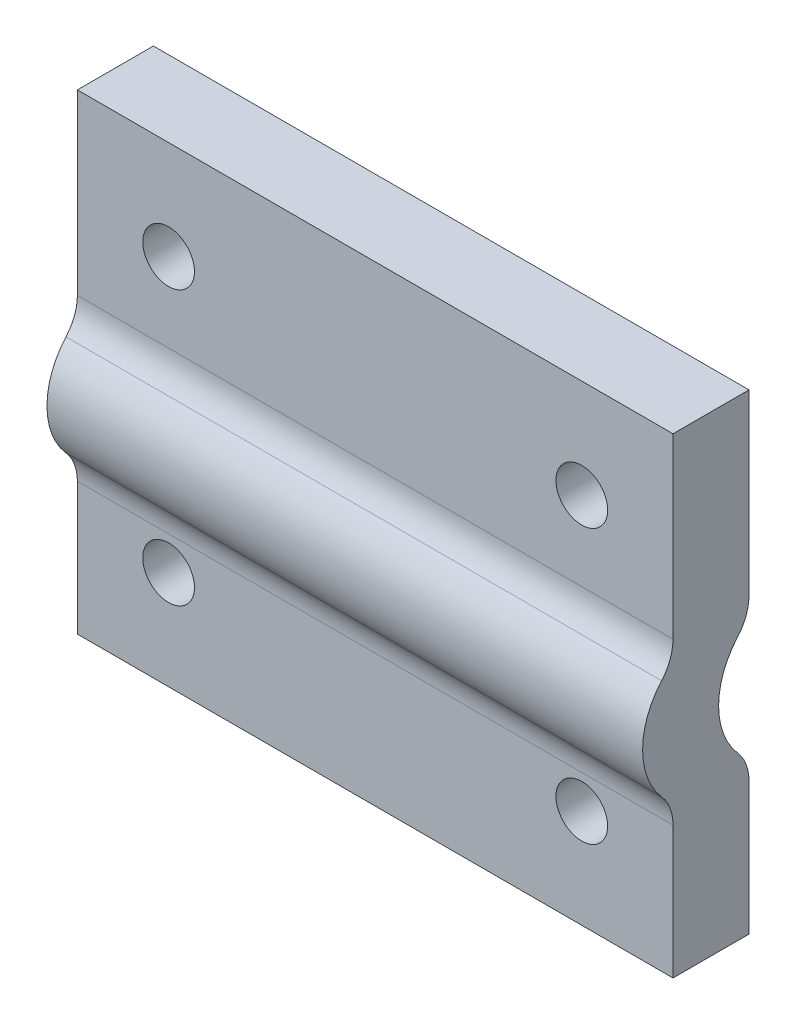
ISO-10303-21;
HEADER;
FILE_DESCRIPTION(('STEP AP214'),'2;1');
FILE_NAME('part.step','',(''),(''),'','','');
FILE_SCHEMA(('AUTOMOTIVE_DESIGN { 1 0 10303 214 1 1 1 1 }'));
ENDSEC;
DATA;
#1=APPLICATION_CONTEXT('core data for automotive mechanical design processes');
#2=APPLICATION_PROTOCOL_DEFINITION('international standard','automotive_design',2000,#1);
#3=PRODUCT_CONTEXT('',#1,'mechanical');
#4=PRODUCT('Part','Part','',(#3));
#5=PRODUCT_RELATED_PRODUCT_CATEGORY('part','',(#4));
#6=PRODUCT_DEFINITION_FORMATION('','',#4);
#7=PRODUCT_DEFINITION_CONTEXT('part definition',#1,'design');
#8=PRODUCT_DEFINITION('design','',#6,#7);
#9=PRODUCT_DEFINITION_SHAPE('','',#8);
#10=(LENGTH_UNIT() NAMED_UNIT(*) SI_UNIT(.MILLI.,.METRE.));
#11=(NAMED_UNIT(*) PLANE_ANGLE_UNIT() SI_UNIT($,.RADIAN.));
#12=(NAMED_UNIT(*) SI_UNIT($,.STERADIAN.) SOLID_ANGLE_UNIT());
#13=UNCERTAINTY_MEASURE_WITH_UNIT(LENGTH_MEASURE(1.E-05),#10,'distance_accuracy_value','');
#14=(GEOMETRIC_REPRESENTATION_CONTEXT(3) GLOBAL_UNCERTAINTY_ASSIGNED_CONTEXT((#13)) GLOBAL_UNIT_ASSIGNED_CONTEXT((#10,
#11,#12)) REPRESENTATION_CONTEXT('',''));
#15=CARTESIAN_POINT('',(0.,0.,0.));
#16=DIRECTION('',(0.,0.,1.));
#17=DIRECTION('',(1.,0.,0.));
#18=AXIS2_PLACEMENT_3D('',#15,#16,#17);
#19=CARTESIAN_POINT('',(-20.5399999999997,0.,5.));
#20=DIRECTION('',(1.,0.,0.));
#21=DIRECTION('',(0.,1.,0.));
#22=AXIS2_PLACEMENT_3D('',#19,#20,#21);
#23=PLANE('',#22);
#24=DIRECTION('',(0.,-1.,0.));
#25=VECTOR('',#24,1.);
#26=CARTESIAN_POINT('',(-20.5399999999997,0.,0.));
#27=LINE('',#26,#25);
#28=CARTESIAN_POINT('',(-20.5399999999997,52.1440002712051,0.));
#29=VERTEX_POINT('',#28);
#30=CARTESIAN_POINT('',(-20.5399999999997,40.4355028933343,0.));
#31=VERTEX_POINT('',#30);
#32=EDGE_CURVE('E154',#29,#31,#27,.T.);
#33=ORIENTED_EDGE('',*,*,#32,.T.);
#34=CARTESIAN_POINT('',(-20.5399999999997,40.4355028933343,3.));
#35=DIRECTION('',(1.,0.,0.));
#36=DIRECTION('',(0.,1.,0.));
#37=AXIS2_PLACEMENT_3D('',#34,#35,#36);
#38=CIRCLE('',#37,3.);
#39=CARTESIAN_POINT('',(-20.5399999999997,38.4511894100358,0.75));
#40=VERTEX_POINT('',#39);
#41=EDGE_CURVE('E184',#31,#40,#38,.F.);
#42=ORIENTED_EDGE('',*,*,#41,.T.);
#43=CARTESIAN_POINT('',(-20.5399999999997,35.144000271205,-3.));
#44=DIRECTION('',(-1.,0.,0.));
#45=DIRECTION('',(0.,-1.,0.));
#46=AXIS2_PLACEMENT_3D('',#43,#44,#45);
#47=CIRCLE('',#46,5.);
#48=CARTESIAN_POINT('',(-20.5399999999997,31.8368111323743,0.75));
#49=VERTEX_POINT('',#48);
#50=EDGE_CURVE('E131',#40,#49,#47,.F.);
#51=ORIENTED_EDGE('',*,*,#50,.T.);
#52=CARTESIAN_POINT('',(-20.5399999999997,29.8524976490759,3.));
#53=DIRECTION('',(1.,0.,0.));
#54=DIRECTION('',(0.,1.,0.));
#55=AXIS2_PLACEMENT_3D('',#52,#53,#54);
#56=CIRCLE('',#55,3.);
#57=CARTESIAN_POINT('',(-20.5399999999997,29.8524976490759,0.));
#58=VERTEX_POINT('',#57);
#59=EDGE_CURVE('E182',#49,#58,#56,.F.);
#60=ORIENTED_EDGE('',*,*,#59,.T.);
#61=DIRECTION('',(0.,-1.,0.));
#62=VECTOR('',#61,1.);
#63=CARTESIAN_POINT('',(-20.5399999999997,0.,0.));
#64=LINE('',#63,#62);
#65=CARTESIAN_POINT('',(-20.5399999999997,21.1440002712051,0.));
#66=VERTEX_POINT('',#65);
#67=EDGE_CURVE('E129',#58,#66,#64,.T.);
#68=ORIENTED_EDGE('',*,*,#67,.T.);
#69=DIRECTION('',(0.,0.,-1.));
#70=VECTOR('',#69,1.);
#71=CARTESIAN_POINT('',(-20.5399999999997,21.1440002712051,5.));
#72=LINE('',#71,#70);
#73=CARTESIAN_POINT('',(-20.5399999999997,21.1440002712051,5.));
#74=VERTEX_POINT('',#73);
#75=EDGE_CURVE('E123',#74,#66,#72,.T.);
#76=ORIENTED_EDGE('',*,*,#75,.F.);
#77=DIRECTION('',(0.,-1.,0.));
#78=VECTOR('',#77,1.);
#79=CARTESIAN_POINT('',(-20.5399999999997,0.,5.));
#80=LINE('',#79,#78);
#81=CARTESIAN_POINT('',(-20.5399999999997,29.8524976490759,5.));
#82=VERTEX_POINT('',#81);
#83=EDGE_CURVE('E108',#82,#74,#80,.T.);
#84=ORIENTED_EDGE('',*,*,#83,.F.);
#85=CARTESIAN_POINT('',(-20.5399999999997,29.8524976490759,8.));
#86=DIRECTION('',(1.,0.,0.));
#87=DIRECTION('',(0.,1.,0.));
#88=AXIS2_PLACEMENT_3D('',#85,#86,#87);
#89=CIRCLE('',#88,3.);
#90=CARTESIAN_POINT('',(-20.5399999999997,31.8368111323744,5.75));
#91=VERTEX_POINT('',#90);
#92=EDGE_CURVE('E25',#82,#91,#89,.T.);
#93=ORIENTED_EDGE('',*,*,#92,.T.);
#94=CARTESIAN_POINT('',(-20.5399999999997,35.144000271205,2.));
#95=DIRECTION('',(-1.,0.,0.));
#96=DIRECTION('',(0.,-1.,0.));
#97=AXIS2_PLACEMENT_3D('',#94,#95,#96);
#98=CIRCLE('',#97,5.);
#99=CARTESIAN_POINT('',(-20.5399999999997,38.4511894100358,5.75));
#100=VERTEX_POINT('',#99);
#101=EDGE_CURVE('E134',#100,#91,#98,.F.);
#102=ORIENTED_EDGE('',*,*,#101,.F.);
#103=CARTESIAN_POINT('',(-20.5399999999997,40.4355028933342,8.));
#104=DIRECTION('',(1.,0.,0.));
#105=DIRECTION('',(0.,1.,0.));
#106=AXIS2_PLACEMENT_3D('',#103,#104,#105);
#107=CIRCLE('',#106,3.);
#108=CARTESIAN_POINT('',(-20.5399999999997,40.4355028933342,5.));
#109=VERTEX_POINT('',#108);
#110=EDGE_CURVE('E204',#100,#109,#107,.T.);
#111=ORIENTED_EDGE('',*,*,#110,.T.);
#112=DIRECTION('',(0.,-1.,0.));
#113=VECTOR('',#112,1.);
#114=CARTESIAN_POINT('',(-20.5399999999997,0.,5.));
#115=LINE('',#114,#113);
#116=CARTESIAN_POINT('',(-20.5399999999997,52.1440002712051,5.));
#117=VERTEX_POINT('',#116);
#118=EDGE_CURVE('E171',#117,#109,#115,.T.);
#119=ORIENTED_EDGE('',*,*,#118,.F.);
#120=DIRECTION('',(0.,0.,-1.));
#121=VECTOR('',#120,1.);
#122=CARTESIAN_POINT('',(-20.5399999999997,52.1440002712051,5.));
#123=LINE('',#122,#121);
#124=EDGE_CURVE('E147',#117,#29,#123,.T.);
#125=ORIENTED_EDGE('',*,*,#124,.T.);
#126=EDGE_LOOP('',(#33,#42,#51,#60,#68,#76,#84,#93,#102,#111,#119,#125));
#127=FACE_BOUND('',#126,.T.);
#128=ADVANCED_FACE('F17',(#127),#23,.F.);
#129=CARTESIAN_POINT('',(18.6350000000003,0.,5.));
#130=DIRECTION('',(-1.,0.,0.));
#131=DIRECTION('',(0.,0.,1.));
#132=AXIS2_PLACEMENT_3D('',#129,#130,#131);
#133=PLANE('',#132);
#134=CARTESIAN_POINT('',(18.6350000000003,35.144000271205,-3.));
#135=DIRECTION('',(-1.,0.,0.));
#136=DIRECTION('',(0.,0.,1.));
#137=AXIS2_PLACEMENT_3D('',#134,#135,#136);
#138=CIRCLE('',#137,5.);
#139=CARTESIAN_POINT('',(18.6350000000003,31.8368111323743,0.75));
#140=VERTEX_POINT('',#139);
#141=CARTESIAN_POINT('',(18.6350000000003,38.4511894100358,0.75));
#142=VERTEX_POINT('',#141);
#143=EDGE_CURVE('E141',#140,#142,#138,.T.);
#144=ORIENTED_EDGE('',*,*,#143,.T.);
#145=CARTESIAN_POINT('',(18.6350000000003,40.4355028933343,3.));
#146=DIRECTION('',(-1.,0.,0.));
#147=DIRECTION('',(0.,0.,1.));
#148=AXIS2_PLACEMENT_3D('',#145,#146,#147);
#149=CIRCLE('',#148,3.);
#150=CARTESIAN_POINT('',(18.6350000000003,40.4355028933343,0.));
#151=VERTEX_POINT('',#150);
#152=EDGE_CURVE('E193',#142,#151,#149,.F.);
#153=ORIENTED_EDGE('',*,*,#152,.T.);
#154=DIRECTION('',(0.,1.,0.));
#155=VECTOR('',#154,1.);
#156=CARTESIAN_POINT('',(18.6350000000003,0.,0.));
#157=LINE('',#156,#155);
#158=CARTESIAN_POINT('',(18.6350000000003,52.1440002712051,0.));
#159=VERTEX_POINT('',#158);
#160=EDGE_CURVE('E165',#151,#159,#157,.T.);
#161=ORIENTED_EDGE('',*,*,#160,.T.);
#162=DIRECTION('',(0.,0.,-1.));
#163=VECTOR('',#162,1.);
#164=CARTESIAN_POINT('',(18.6350000000003,52.1440002712051,5.));
#165=LINE('',#164,#163);
#166=CARTESIAN_POINT('',(18.6350000000003,52.1440002712051,5.));
#167=VERTEX_POINT('',#166);
#168=EDGE_CURVE('E148',#167,#159,#165,.T.);
#169=ORIENTED_EDGE('',*,*,#168,.F.);
#170=DIRECTION('',(0.,1.,0.));
#171=VECTOR('',#170,1.);
#172=CARTESIAN_POINT('',(18.6350000000003,0.,5.));
#173=LINE('',#172,#171);
#174=CARTESIAN_POINT('',(18.6350000000003,40.4355028933343,5.));
#175=VERTEX_POINT('',#174);
#176=EDGE_CURVE('E158',#175,#167,#173,.T.);
#177=ORIENTED_EDGE('',*,*,#176,.F.);
#178=CARTESIAN_POINT('',(18.6350000000003,40.4355028933343,8.));
#179=DIRECTION('',(-1.,0.,0.));
#180=DIRECTION('',(0.,0.,1.));
#181=AXIS2_PLACEMENT_3D('',#178,#179,#180);
#182=CIRCLE('',#181,3.);
#183=CARTESIAN_POINT('',(18.6350000000003,38.4511894100358,5.75));
#184=VERTEX_POINT('',#183);
#185=EDGE_CURVE('E206',#175,#184,#182,.T.);
#186=ORIENTED_EDGE('',*,*,#185,.T.);
#187=CARTESIAN_POINT('',(18.6350000000003,35.144000271205,2.));
#188=DIRECTION('',(-1.,0.,0.));
#189=DIRECTION('',(0.,0.,1.));
#190=AXIS2_PLACEMENT_3D('',#187,#188,#189);
#191=CIRCLE('',#190,5.);
#192=CARTESIAN_POINT('',(18.6350000000003,31.8368111323744,5.75));
#193=VERTEX_POINT('',#192);
#194=EDGE_CURVE('E139',#193,#184,#191,.T.);
#195=ORIENTED_EDGE('',*,*,#194,.F.);
#196=CARTESIAN_POINT('',(18.6350000000003,29.8524976490759,8.));
#197=DIRECTION('',(-1.,0.,0.));
#198=DIRECTION('',(0.,0.,1.));
#199=AXIS2_PLACEMENT_3D('',#196,#197,#198);
#200=CIRCLE('',#199,3.);
#201=CARTESIAN_POINT('',(18.6350000000003,29.8524976490759,5.));
#202=VERTEX_POINT('',#201);
#203=EDGE_CURVE('E11',#193,#202,#200,.T.);
#204=ORIENTED_EDGE('',*,*,#203,.T.);
#205=DIRECTION('',(0.,1.,0.));
#206=VECTOR('',#205,1.);
#207=CARTESIAN_POINT('',(18.6350000000003,0.,5.));
#208=LINE('',#207,#206);
#209=CARTESIAN_POINT('',(18.6350000000003,21.1440002712051,5.));
#210=VERTEX_POINT('',#209);
#211=EDGE_CURVE('E126',#210,#202,#208,.T.);
#212=ORIENTED_EDGE('',*,*,#211,.F.);
#213=DIRECTION('',(0.,0.,-1.));
#214=VECTOR('',#213,1.);
#215=CARTESIAN_POINT('',(18.6350000000003,21.1440002712051,5.));
#216=LINE('',#215,#214);
#217=CARTESIAN_POINT('',(18.6350000000003,21.1440002712051,0.));
#218=VERTEX_POINT('',#217);
#219=EDGE_CURVE('E125',#210,#218,#216,.T.);
#220=ORIENTED_EDGE('',*,*,#219,.T.);
#221=DIRECTION('',(0.,1.,0.));
#222=VECTOR('',#221,1.);
#223=CARTESIAN_POINT('',(18.6350000000003,0.,0.));
#224=LINE('',#223,#222);
#225=CARTESIAN_POINT('',(18.6350000000003,29.8524976490759,0.));
#226=VERTEX_POINT('',#225);
#227=EDGE_CURVE('E118',#218,#226,#224,.T.);
#228=ORIENTED_EDGE('',*,*,#227,.T.);
#229=CARTESIAN_POINT('',(18.6350000000003,29.8524976490759,3.));
#230=DIRECTION('',(-1.,0.,0.));
#231=DIRECTION('',(0.,0.,1.));
#232=AXIS2_PLACEMENT_3D('',#229,#230,#231);
#233=CIRCLE('',#232,3.);
#234=EDGE_CURVE('E191',#226,#140,#233,.F.);
#235=ORIENTED_EDGE('',*,*,#234,.T.);
#236=EDGE_LOOP('',(#144,#153,#161,#169,#177,#186,#195,#204,#212,#220,#228,#235));
#237=FACE_BOUND('',#236,.T.);
#238=ADVANCED_FACE('F227',(#237),#133,.F.);
#239=CARTESIAN_POINT('',(0.,0.,5.));
#240=DIRECTION('',(0.,0.,1.));
#241=DIRECTION('',(1.,0.,0.));
#242=AXIS2_PLACEMENT_3D('',#239,#240,#241);
#243=PLANE('',#242);
#244=CARTESIAN_POINT('',(-14.5399999999997,45.6440002712051,5.));
#245=DIRECTION('',(0.,0.,-1.));
#246=DIRECTION('',(-1.,0.,0.));
#247=AXIS2_PLACEMENT_3D('',#244,#245,#246);
#248=CIRCLE('',#247,1.7);
#249=CARTESIAN_POINT('',(-16.2399999999997,45.6440002712051,5.));
#250=VERTEX_POINT('',#249);
#251=EDGE_CURVE('E161',#250,#250,#248,.T.);
#252=ORIENTED_EDGE('',*,*,#251,.T.);
#253=EDGE_LOOP('',(#252));
#254=FACE_BOUND('',#253,.T.);
#255=CARTESIAN_POINT('',(12.6350000000003,45.6440002712051,5.));
#256=DIRECTION('',(0.,0.,-1.));
#257=DIRECTION('',(-1.,0.,0.));
#258=AXIS2_PLACEMENT_3D('',#255,#256,#257);
#259=CIRCLE('',#258,1.7);
#260=CARTESIAN_POINT('',(10.9350000000003,45.6440002712051,5.));
#261=VERTEX_POINT('',#260);
#262=EDGE_CURVE('E164',#261,#261,#259,.T.);
#263=ORIENTED_EDGE('',*,*,#262,.T.);
#264=EDGE_LOOP('',(#263));
#265=FACE_BOUND('',#264,.T.);
#266=ORIENTED_EDGE('',*,*,#118,.T.);
#267=DIRECTION('',(-1.,0.,0.));
#268=VECTOR('',#267,1.);
#269=CARTESIAN_POINT('',(0.,40.4355028933343,5.));
#270=LINE('',#269,#268);
#271=EDGE_CURVE('E200',#109,#175,#270,.F.);
#272=ORIENTED_EDGE('',*,*,#271,.T.);
#273=ORIENTED_EDGE('',*,*,#176,.T.);
#274=DIRECTION('',(1.,0.,0.));
#275=VECTOR('',#274,1.);
#276=CARTESIAN_POINT('',(0.,52.1440002712051,5.));
#277=LINE('',#276,#275);
#278=EDGE_CURVE('E152',#117,#167,#277,.T.);
#279=ORIENTED_EDGE('',*,*,#278,.F.);
#280=EDGE_LOOP('',(#266,#272,#273,#279));
#281=FACE_BOUND('',#280,.T.);
#282=ADVANCED_FACE('F233',(#254,#265,#281),#243,.T.);
#283=CARTESIAN_POINT('',(0.,0.,0.));
#284=DIRECTION('',(0.,0.,1.));
#285=DIRECTION('',(1.,0.,0.));
#286=AXIS2_PLACEMENT_3D('',#283,#284,#285);
#287=PLANE('',#286);
#288=CARTESIAN_POINT('',(12.6350000000003,45.6440002712051,0.));
#289=DIRECTION('',(0.,0.,-1.));
#290=DIRECTION('',(-1.,0.,0.));
#291=AXIS2_PLACEMENT_3D('',#288,#289,#290);
#292=CIRCLE('',#291,1.7);
#293=CARTESIAN_POINT('',(10.9350000000003,45.6440002712051,0.));
#294=VERTEX_POINT('',#293);
#295=EDGE_CURVE('E168',#294,#294,#292,.T.);
#296=ORIENTED_EDGE('',*,*,#295,.F.);
#297=EDGE_LOOP('',(#296));
#298=FACE_BOUND('',#297,.T.);
#299=CARTESIAN_POINT('',(-14.5399999999997,45.6440002712051,0.));
#300=DIRECTION('',(0.,0.,-1.));
#301=DIRECTION('',(-1.,0.,0.));
#302=AXIS2_PLACEMENT_3D('',#299,#300,#301);
#303=CIRCLE('',#302,1.7);
#304=CARTESIAN_POINT('',(-16.2399999999997,45.6440002712051,0.));
#305=VERTEX_POINT('',#304);
#306=EDGE_CURVE('E151',#305,#305,#303,.T.);
#307=ORIENTED_EDGE('',*,*,#306,.F.);
#308=EDGE_LOOP('',(#307));
#309=FACE_BOUND('',#308,.T.);
#310=ORIENTED_EDGE('',*,*,#160,.F.);
#311=DIRECTION('',(1.,0.,0.));
#312=VECTOR('',#311,1.);
#313=CARTESIAN_POINT('',(-20.5399999999997,40.4355028933343,0.));
#314=LINE('',#313,#312);
#315=EDGE_CURVE('E174',#151,#31,#314,.F.);
#316=ORIENTED_EDGE('',*,*,#315,.T.);
#317=ORIENTED_EDGE('',*,*,#32,.F.);
#318=DIRECTION('',(1.,0.,0.));
#319=VECTOR('',#318,1.);
#320=CARTESIAN_POINT('',(0.,52.1440002712051,0.));
#321=LINE('',#320,#319);
#322=EDGE_CURVE('E155',#29,#159,#321,.T.);
#323=ORIENTED_EDGE('',*,*,#322,.T.);
#324=EDGE_LOOP('',(#310,#316,#317,#323));
#325=FACE_BOUND('',#324,.T.);
#326=ADVANCED_FACE('F253',(#298,#309,#325),#287,.F.);
#327=CARTESIAN_POINT('',(0.,52.1440002712051,5.));
#328=DIRECTION('',(0.,1.,0.));
#329=DIRECTION('',(0.,0.,1.));
#330=AXIS2_PLACEMENT_3D('',#327,#328,#329);
#331=PLANE('',#330);
#332=ORIENTED_EDGE('',*,*,#322,.F.);
#333=ORIENTED_EDGE('',*,*,#124,.F.);
#334=ORIENTED_EDGE('',*,*,#278,.T.);
#335=ORIENTED_EDGE('',*,*,#168,.T.);
#336=EDGE_LOOP('',(#332,#333,#334,#335));
#337=FACE_BOUND('',#336,.T.);
#338=ADVANCED_FACE('F257',(#337),#331,.T.);
#339=CARTESIAN_POINT('',(-14.5399999999997,45.6440002712051,0.));
#340=DIRECTION('',(0.,0.,-1.));
#341=DIRECTION('',(-1.,0.,0.));
#342=AXIS2_PLACEMENT_3D('',#339,#340,#341);
#343=CYLINDRICAL_SURFACE('',#342,1.7);
#344=ORIENTED_EDGE('',*,*,#251,.F.);
#345=EDGE_LOOP('',(#344));
#346=FACE_BOUND('',#345,.T.);
#347=ORIENTED_EDGE('',*,*,#306,.T.);
#348=EDGE_LOOP('',(#347));
#349=FACE_BOUND('',#348,.T.);
#350=ADVANCED_FACE('F277',(#346,#349),#343,.F.);
#351=CARTESIAN_POINT('',(12.6350000000003,45.6440002712051,0.));
#352=DIRECTION('',(0.,0.,-1.));
#353=DIRECTION('',(-1.,0.,0.));
#354=AXIS2_PLACEMENT_3D('',#351,#352,#353);
#355=CYLINDRICAL_SURFACE('',#354,1.7);
#356=ORIENTED_EDGE('',*,*,#262,.F.);
#357=EDGE_LOOP('',(#356));
#358=FACE_BOUND('',#357,.T.);
#359=ORIENTED_EDGE('',*,*,#295,.T.);
#360=EDGE_LOOP('',(#359));
#361=FACE_BOUND('',#360,.T.);
#362=ADVANCED_FACE('F274',(#358,#361),#355,.F.);
#363=CARTESIAN_POINT('',(29.2651458127349,35.144000271205,2.));
#364=DIRECTION('',(-1.,0.,0.));
#365=DIRECTION('',(0.,-1.,0.));
#366=AXIS2_PLACEMENT_3D('',#363,#364,#365);
#367=CYLINDRICAL_SURFACE('',#366,5.);
#368=ORIENTED_EDGE('',*,*,#194,.T.);
#369=DIRECTION('',(-1.,0.,0.));
#370=VECTOR('',#369,1.);
#371=CARTESIAN_POINT('',(29.2651458127349,38.4511894100358,5.75));
#372=LINE('',#371,#370);
#373=EDGE_CURVE('E197',#184,#100,#372,.T.);
#374=ORIENTED_EDGE('',*,*,#373,.T.);
#375=ORIENTED_EDGE('',*,*,#101,.T.);
#376=DIRECTION('',(-1.,0.,0.));
#377=VECTOR('',#376,1.);
#378=CARTESIAN_POINT('',(29.2651458127349,31.8368111323744,5.75));
#379=LINE('',#378,#377);
#380=EDGE_CURVE('E195',#91,#193,#379,.F.);
#381=ORIENTED_EDGE('',*,*,#380,.T.);
#382=EDGE_LOOP('',(#368,#374,#375,#381));
#383=FACE_BOUND('',#382,.T.);
#384=ADVANCED_FACE('F211',(#383),#367,.T.);
#385=CARTESIAN_POINT('',(29.2651458127349,35.144000271205,-3.));
#386=DIRECTION('',(-1.,0.,0.));
#387=DIRECTION('',(0.,-1.,0.));
#388=AXIS2_PLACEMENT_3D('',#385,#386,#387);
#389=CYLINDRICAL_SURFACE('',#388,5.);
#390=ORIENTED_EDGE('',*,*,#50,.F.);
#391=DIRECTION('',(-1.,0.,0.));
#392=VECTOR('',#391,1.);
#393=CARTESIAN_POINT('',(29.2651458127349,38.4511894100358,0.75));
#394=LINE('',#393,#392);
#395=EDGE_CURVE('E189',#40,#142,#394,.F.);
#396=ORIENTED_EDGE('',*,*,#395,.T.);
#397=ORIENTED_EDGE('',*,*,#143,.F.);
#398=DIRECTION('',(-1.,0.,0.));
#399=VECTOR('',#398,1.);
#400=CARTESIAN_POINT('',(29.2651458127349,31.8368111323743,0.75));
#401=LINE('',#400,#399);
#402=EDGE_CURVE('E186',#140,#49,#401,.T.);
#403=ORIENTED_EDGE('',*,*,#402,.T.);
#404=EDGE_LOOP('',(#390,#396,#397,#403));
#405=FACE_BOUND('',#404,.T.);
#406=ADVANCED_FACE('F284',(#405),#389,.F.);
#407=CARTESIAN_POINT('',(0.,21.1440002712051,5.));
#408=DIRECTION('',(0.,1.,0.));
#409=DIRECTION('',(0.,0.,1.));
#410=AXIS2_PLACEMENT_3D('',#407,#408,#409);
#411=PLANE('',#410);
#412=DIRECTION('',(1.,0.,0.));
#413=VECTOR('',#412,1.);
#414=CARTESIAN_POINT('',(0.,21.1440002712051,0.));
#415=LINE('',#414,#413);
#416=EDGE_CURVE('E322',#66,#218,#415,.T.);
#417=ORIENTED_EDGE('',*,*,#416,.T.);
#418=ORIENTED_EDGE('',*,*,#219,.F.);
#419=DIRECTION('',(1.,0.,0.));
#420=VECTOR('',#419,1.);
#421=CARTESIAN_POINT('',(0.,21.1440002712051,5.));
#422=LINE('',#421,#420);
#423=EDGE_CURVE('E112',#74,#210,#422,.T.);
#424=ORIENTED_EDGE('',*,*,#423,.F.);
#425=ORIENTED_EDGE('',*,*,#75,.T.);
#426=EDGE_LOOP('',(#417,#418,#424,#425));
#427=FACE_BOUND('',#426,.T.);
#428=ADVANCED_FACE('F122',(#427),#411,.F.);
#429=CARTESIAN_POINT('',(12.6350000000003,27.6440002712051,5.));
#430=DIRECTION('',(0.,0.,1.));
#431=DIRECTION('',(1.,0.,0.));
#432=AXIS2_PLACEMENT_3D('',#429,#430,#431);
#433=CYLINDRICAL_SURFACE('',#432,1.7);
#434=CARTESIAN_POINT('',(12.6350000000003,27.6440002712051,0.));
#435=DIRECTION('',(0.,0.,1.));
#436=DIRECTION('',(1.,0.,0.));
#437=AXIS2_PLACEMENT_3D('',#434,#435,#436);
#438=CIRCLE('',#437,1.7);
#439=CARTESIAN_POINT('',(14.3350000000003,27.6440002712051,0.));
#440=VERTEX_POINT('',#439);
#441=EDGE_CURVE('E317',#440,#440,#438,.T.);
#442=ORIENTED_EDGE('',*,*,#441,.F.);
#443=EDGE_LOOP('',(#442));
#444=FACE_BOUND('',#443,.T.);
#445=CARTESIAN_POINT('',(12.6350000000003,27.6440002712051,5.));
#446=DIRECTION('',(0.,0.,1.));
#447=DIRECTION('',(1.,0.,0.));
#448=AXIS2_PLACEMENT_3D('',#445,#446,#447);
#449=CIRCLE('',#448,1.7);
#450=CARTESIAN_POINT('',(14.3350000000003,27.6440002712051,5.));
#451=VERTEX_POINT('',#450);
#452=EDGE_CURVE('E312',#451,#451,#449,.T.);
#453=ORIENTED_EDGE('',*,*,#452,.T.);
#454=EDGE_LOOP('',(#453));
#455=FACE_BOUND('',#454,.T.);
#456=ADVANCED_FACE('F291',(#444,#455),#433,.F.);
#457=CARTESIAN_POINT('',(-14.5399999999997,27.6440002712051,5.));
#458=DIRECTION('',(0.,0.,1.));
#459=DIRECTION('',(1.,0.,0.));
#460=AXIS2_PLACEMENT_3D('',#457,#458,#459);
#461=CYLINDRICAL_SURFACE('',#460,1.7);
#462=CARTESIAN_POINT('',(-14.5399999999997,27.6440002712051,0.));
#463=DIRECTION('',(0.,0.,1.));
#464=DIRECTION('',(1.,0.,0.));
#465=AXIS2_PLACEMENT_3D('',#462,#463,#464);
#466=CIRCLE('',#465,1.7);
#467=CARTESIAN_POINT('',(-12.8399999999997,27.6440002712051,0.));
#468=VERTEX_POINT('',#467);
#469=EDGE_CURVE('E307',#468,#468,#466,.T.);
#470=ORIENTED_EDGE('',*,*,#469,.F.);
#471=EDGE_LOOP('',(#470));
#472=FACE_BOUND('',#471,.T.);
#473=CARTESIAN_POINT('',(-14.5399999999997,27.6440002712051,5.));
#474=DIRECTION('',(0.,0.,1.));
#475=DIRECTION('',(1.,0.,0.));
#476=AXIS2_PLACEMENT_3D('',#473,#474,#475);
#477=CIRCLE('',#476,1.7);
#478=CARTESIAN_POINT('',(-12.8399999999997,27.6440002712051,5.));
#479=VERTEX_POINT('',#478);
#480=EDGE_CURVE('E310',#479,#479,#477,.T.);
#481=ORIENTED_EDGE('',*,*,#480,.T.);
#482=EDGE_LOOP('',(#481));
#483=FACE_BOUND('',#482,.T.);
#484=ADVANCED_FACE('F295',(#472,#483),#461,.F.);
#485=CARTESIAN_POINT('',(0.,0.,5.));
#486=DIRECTION('',(0.,0.,1.));
#487=DIRECTION('',(1.,0.,0.));
#488=AXIS2_PLACEMENT_3D('',#485,#486,#487);
#489=PLANE('',#488);
#490=ORIENTED_EDGE('',*,*,#211,.T.);
#491=DIRECTION('',(-1.,0.,0.));
#492=VECTOR('',#491,1.);
#493=CARTESIAN_POINT('',(0.,29.8524976490759,5.));
#494=LINE('',#493,#492);
#495=EDGE_CURVE('E115',#202,#82,#494,.T.);
#496=ORIENTED_EDGE('',*,*,#495,.T.);
#497=ORIENTED_EDGE('',*,*,#83,.T.);
#498=ORIENTED_EDGE('',*,*,#423,.T.);
#499=EDGE_LOOP('',(#490,#496,#497,#498));
#500=FACE_BOUND('',#499,.T.);
#501=ORIENTED_EDGE('',*,*,#480,.F.);
#502=EDGE_LOOP('',(#501));
#503=FACE_BOUND('',#502,.T.);
#504=ORIENTED_EDGE('',*,*,#452,.F.);
#505=EDGE_LOOP('',(#504));
#506=FACE_BOUND('',#505,.T.);
#507=ADVANCED_FACE('F110',(#500,#503,#506),#489,.T.);
#508=CARTESIAN_POINT('',(0.,0.,0.));
#509=DIRECTION('',(0.,0.,1.));
#510=DIRECTION('',(1.,0.,0.));
#511=AXIS2_PLACEMENT_3D('',#508,#509,#510);
#512=PLANE('',#511);
#513=ORIENTED_EDGE('',*,*,#469,.T.);
#514=EDGE_LOOP('',(#513));
#515=FACE_BOUND('',#514,.T.);
#516=ORIENTED_EDGE('',*,*,#441,.T.);
#517=EDGE_LOOP('',(#516));
#518=FACE_BOUND('',#517,.T.);
#519=ORIENTED_EDGE('',*,*,#67,.F.);
#520=DIRECTION('',(1.,0.,0.));
#521=VECTOR('',#520,1.);
#522=CARTESIAN_POINT('',(18.6350000000003,29.8524976490759,0.));
#523=LINE('',#522,#521);
#524=EDGE_CURVE('E32',#58,#226,#523,.T.);
#525=ORIENTED_EDGE('',*,*,#524,.T.);
#526=ORIENTED_EDGE('',*,*,#227,.F.);
#527=ORIENTED_EDGE('',*,*,#416,.F.);
#528=EDGE_LOOP('',(#519,#525,#526,#527));
#529=FACE_BOUND('',#528,.T.);
#530=ADVANCED_FACE('F238',(#515,#518,#529),#512,.F.);
#531=CARTESIAN_POINT('',(29.2651458127349,40.4355028933343,3.));
#532=DIRECTION('',(-1.,0.,0.));
#533=DIRECTION('',(0.,-1.,0.));
#534=AXIS2_PLACEMENT_3D('',#531,#532,#533);
#535=CYLINDRICAL_SURFACE('',#534,3.);
#536=ORIENTED_EDGE('',*,*,#152,.F.);
#537=ORIENTED_EDGE('',*,*,#395,.F.);
#538=ORIENTED_EDGE('',*,*,#41,.F.);
#539=ORIENTED_EDGE('',*,*,#315,.F.);
#540=EDGE_LOOP('',(#536,#537,#538,#539));
#541=FACE_BOUND('',#540,.T.);
#542=ADVANCED_FACE('F223',(#541),#535,.T.);
#543=CARTESIAN_POINT('',(29.2651458127349,40.4355028933343,8.));
#544=DIRECTION('',(-1.,0.,0.));
#545=DIRECTION('',(0.,-1.,0.));
#546=AXIS2_PLACEMENT_3D('',#543,#544,#545);
#547=CYLINDRICAL_SURFACE('',#546,3.);
#548=ORIENTED_EDGE('',*,*,#185,.F.);
#549=ORIENTED_EDGE('',*,*,#271,.F.);
#550=ORIENTED_EDGE('',*,*,#110,.F.);
#551=ORIENTED_EDGE('',*,*,#373,.F.);
#552=EDGE_LOOP('',(#548,#549,#550,#551));
#553=FACE_BOUND('',#552,.T.);
#554=ADVANCED_FACE('F215',(#553),#547,.F.);
#555=CARTESIAN_POINT('',(29.2651458127349,29.8524976490759,8.));
#556=DIRECTION('',(-1.,0.,0.));
#557=DIRECTION('',(0.,-1.,0.));
#558=AXIS2_PLACEMENT_3D('',#555,#556,#557);
#559=CYLINDRICAL_SURFACE('',#558,3.);
#560=ORIENTED_EDGE('',*,*,#203,.F.);
#561=ORIENTED_EDGE('',*,*,#380,.F.);
#562=ORIENTED_EDGE('',*,*,#92,.F.);
#563=ORIENTED_EDGE('',*,*,#495,.F.);
#564=EDGE_LOOP('',(#560,#561,#562,#563));
#565=FACE_BOUND('',#564,.T.);
#566=ADVANCED_FACE('F213',(#565),#559,.F.);
#567=CARTESIAN_POINT('',(29.2651458127349,29.8524976490759,3.));
#568=DIRECTION('',(-1.,0.,0.));
#569=DIRECTION('',(0.,-1.,0.));
#570=AXIS2_PLACEMENT_3D('',#567,#568,#569);
#571=CYLINDRICAL_SURFACE('',#570,3.);
#572=ORIENTED_EDGE('',*,*,#234,.F.);
#573=ORIENTED_EDGE('',*,*,#524,.F.);
#574=ORIENTED_EDGE('',*,*,#59,.F.);
#575=ORIENTED_EDGE('',*,*,#402,.F.);
#576=EDGE_LOOP('',(#572,#573,#574,#575));
#577=FACE_BOUND('',#576,.T.);
#578=ADVANCED_FACE('F19',(#577),#571,.T.);
#579=CLOSED_SHELL('',(#128,#238,#282,#326,#338,#350,#362,#384,#406,#428,#456,#484,#507,#530,
#542,#554,#566,#578));
#580=MANIFOLD_SOLID_BREP('B1',#579);
#581=ADVANCED_BREP_SHAPE_REPRESENTATION('',(#18,#580),#14);
#582=SHAPE_DEFINITION_REPRESENTATION(#9,#581);
ENDSEC;
END-ISO-10303-21;
